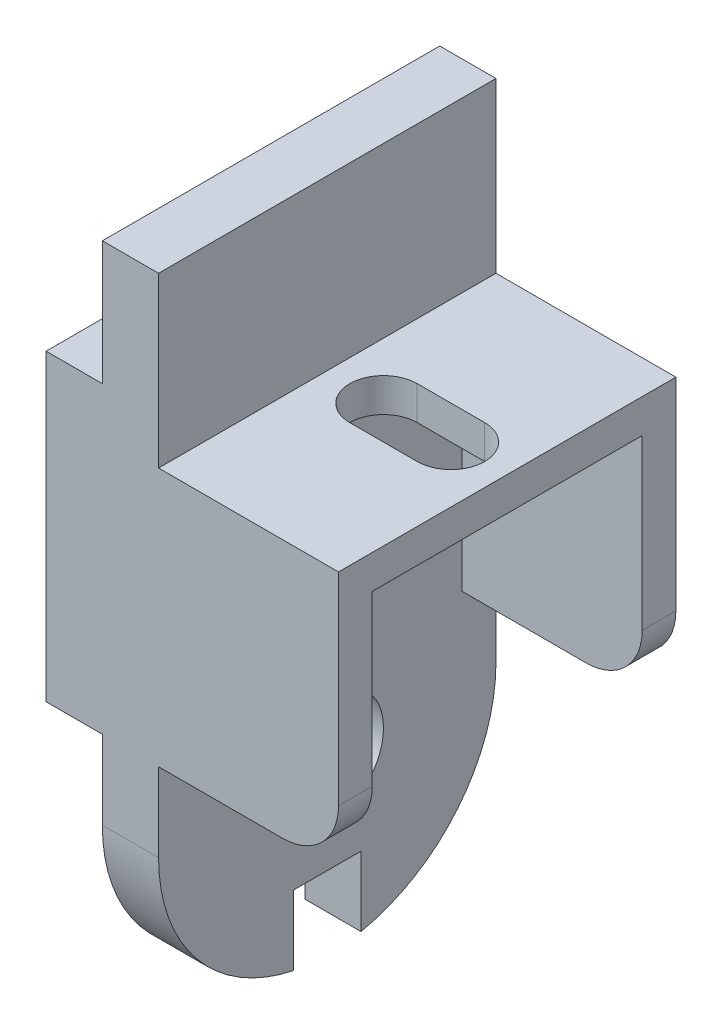
ISO-10303-21;
HEADER;
FILE_DESCRIPTION(('STEP AP214'),'2;1');
FILE_NAME('part.step','',(''),(''),'','','');
FILE_SCHEMA(('AUTOMOTIVE_DESIGN { 1 0 10303 214 1 1 1 1 }'));
ENDSEC;
DATA;
#1=APPLICATION_CONTEXT('core data for automotive mechanical design processes');
#2=APPLICATION_PROTOCOL_DEFINITION('international standard','automotive_design',2000,#1);
#3=PRODUCT_CONTEXT('',#1,'mechanical');
#4=PRODUCT('Part','Part','',(#3));
#5=PRODUCT_RELATED_PRODUCT_CATEGORY('part','',(#4));
#6=PRODUCT_DEFINITION_FORMATION('','',#4);
#7=PRODUCT_DEFINITION_CONTEXT('part definition',#1,'design');
#8=PRODUCT_DEFINITION('design','',#6,#7);
#9=PRODUCT_DEFINITION_SHAPE('','',#8);
#10=(LENGTH_UNIT() NAMED_UNIT(*) SI_UNIT(.MILLI.,.METRE.));
#11=(NAMED_UNIT(*) PLANE_ANGLE_UNIT() SI_UNIT($,.RADIAN.));
#12=(NAMED_UNIT(*) SI_UNIT($,.STERADIAN.) SOLID_ANGLE_UNIT());
#13=UNCERTAINTY_MEASURE_WITH_UNIT(LENGTH_MEASURE(1.E-05),#10,'distance_accuracy_value','');
#14=(GEOMETRIC_REPRESENTATION_CONTEXT(3) GLOBAL_UNCERTAINTY_ASSIGNED_CONTEXT((#13)) GLOBAL_UNIT_ASSIGNED_CONTEXT((#10,
#11,#12)) REPRESENTATION_CONTEXT('',''));
#15=CARTESIAN_POINT('',(0.,0.,0.));
#16=DIRECTION('',(0.,0.,1.));
#17=DIRECTION('',(1.,0.,0.));
#18=AXIS2_PLACEMENT_3D('',#15,#16,#17);
#19=CARTESIAN_POINT('',(0.,0.,0.));
#20=DIRECTION('',(1.,0.,0.));
#21=DIRECTION('',(0.,0.,-1.));
#22=AXIS2_PLACEMENT_3D('',#19,#20,#21);
#23=PLANE('',#22);
#24=DIRECTION('',(0.,0.,-1.));
#25=VECTOR('',#24,1.);
#26=CARTESIAN_POINT('',(0.,34.,-15.));
#27=LINE('',#26,#25);
#28=CARTESIAN_POINT('',(0.,34.,15.));
#29=VERTEX_POINT('',#28);
#30=CARTESIAN_POINT('',(0.,34.,-15.));
#31=VERTEX_POINT('',#30);
#32=EDGE_CURVE('E263',#29,#31,#27,.T.);
#33=ORIENTED_EDGE('',*,*,#32,.F.);
#34=DIRECTION('',(0.,1.,0.));
#35=VECTOR('',#34,1.);
#36=CARTESIAN_POINT('',(0.,0.,15.));
#37=LINE('',#36,#35);
#38=CARTESIAN_POINT('',(0.,45.,15.));
#39=VERTEX_POINT('',#38);
#40=EDGE_CURVE('E278',#29,#39,#37,.T.);
#41=ORIENTED_EDGE('',*,*,#40,.T.);
#42=DIRECTION('',(0.,0.,-1.));
#43=VECTOR('',#42,1.);
#44=CARTESIAN_POINT('',(0.,45.,0.));
#45=LINE('',#44,#43);
#46=CARTESIAN_POINT('',(0.,45.,-15.));
#47=VERTEX_POINT('',#46);
#48=EDGE_CURVE('E316',#39,#47,#45,.T.);
#49=ORIENTED_EDGE('',*,*,#48,.T.);
#50=DIRECTION('',(0.,-1.,0.));
#51=VECTOR('',#50,1.);
#52=CARTESIAN_POINT('',(0.,0.,-15.));
#53=LINE('',#52,#51);
#54=EDGE_CURVE('E318',#47,#31,#53,.T.);
#55=ORIENTED_EDGE('',*,*,#54,.T.);
#56=EDGE_LOOP('',(#33,#41,#49,#55));
#57=FACE_BOUND('',#56,.T.);
#58=ADVANCED_FACE('F49',(#57),#23,.F.);
#59=CARTESIAN_POINT('',(0.,0.,0.));
#60=DIRECTION('',(1.,0.,0.));
#61=DIRECTION('',(0.,0.,-1.));
#62=AXIS2_PLACEMENT_3D('',#59,#60,#61);
#63=CIRCLE('',#62,5.);
#64=CARTESIAN_POINT('',(0.,0.,-5.));
#65=VERTEX_POINT('',#64);
#66=EDGE_CURVE('E367',#65,#65,#63,.T.);
#67=ORIENTED_EDGE('',*,*,#66,.T.);
#68=EDGE_LOOP('',(#67));
#69=FACE_BOUND('',#68,.T.);
#70=DIRECTION('',(0.,0.,1.));
#71=VECTOR('',#70,1.);
#72=CARTESIAN_POINT('',(0.,7.,-15.));
#73=LINE('',#72,#71);
#74=CARTESIAN_POINT('',(0.,7.,-15.));
#75=VERTEX_POINT('',#74);
#76=CARTESIAN_POINT('',(0.,7.,15.));
#77=VERTEX_POINT('',#76);
#78=EDGE_CURVE('E258',#75,#77,#73,.T.);
#79=ORIENTED_EDGE('',*,*,#78,.F.);
#80=CARTESIAN_POINT('',(0.,0.,-15.));
#81=VERTEX_POINT('',#80);
#82=EDGE_CURVE('E320',#75,#81,#53,.T.);
#83=ORIENTED_EDGE('',*,*,#82,.T.);
#84=CARTESIAN_POINT('',(0.,0.,0.));
#85=DIRECTION('',(1.,0.,0.));
#86=DIRECTION('',(0.,0.,-1.));
#87=AXIS2_PLACEMENT_3D('',#84,#85,#86);
#88=CIRCLE('',#87,15.);
#89=CARTESIAN_POINT('',(0.,-14.6969384566991,-3.));
#90=VERTEX_POINT('',#89);
#91=EDGE_CURVE('E331',#90,#81,#88,.T.);
#92=ORIENTED_EDGE('',*,*,#91,.F.);
#93=DIRECTION('',(0.,1.,0.));
#94=VECTOR('',#93,1.);
#95=CARTESIAN_POINT('',(0.,0.,-3.));
#96=LINE('',#95,#94);
#97=CARTESIAN_POINT('',(0.,-8.5,-3.));
#98=VERTEX_POINT('',#97);
#99=EDGE_CURVE('E371',#90,#98,#96,.T.);
#100=ORIENTED_EDGE('',*,*,#99,.T.);
#101=DIRECTION('',(0.,0.,-1.));
#102=VECTOR('',#101,1.);
#103=CARTESIAN_POINT('',(0.,-8.5,0.));
#104=LINE('',#103,#102);
#105=CARTESIAN_POINT('',(0.,-8.5,3.));
#106=VERTEX_POINT('',#105);
#107=EDGE_CURVE('E373',#106,#98,#104,.T.);
#108=ORIENTED_EDGE('',*,*,#107,.F.);
#109=DIRECTION('',(0.,1.,0.));
#110=VECTOR('',#109,1.);
#111=CARTESIAN_POINT('',(0.,0.,3.));
#112=LINE('',#111,#110);
#113=CARTESIAN_POINT('',(0.,-14.6969384566991,3.));
#114=VERTEX_POINT('',#113);
#115=EDGE_CURVE('E327',#114,#106,#112,.T.);
#116=ORIENTED_EDGE('',*,*,#115,.F.);
#117=CARTESIAN_POINT('',(0.,0.,15.));
#118=VERTEX_POINT('',#117);
#119=EDGE_CURVE('E317',#118,#114,#88,.T.);
#120=ORIENTED_EDGE('',*,*,#119,.F.);
#121=EDGE_CURVE('E315',#118,#77,#37,.T.);
#122=ORIENTED_EDGE('',*,*,#121,.T.);
#123=EDGE_LOOP('',(#79,#83,#92,#100,#108,#116,#120,#122));
#124=FACE_BOUND('',#123,.T.);
#125=ADVANCED_FACE('F430',(#69,#124),#23,.F.);
#126=CARTESIAN_POINT('',(5.,0.,0.));
#127=DIRECTION('',(1.,0.,0.));
#128=DIRECTION('',(0.,0.,-1.));
#129=AXIS2_PLACEMENT_3D('',#126,#127,#128);
#130=PLANE('',#129);
#131=CARTESIAN_POINT('',(5.,0.,0.));
#132=DIRECTION('',(1.,0.,0.));
#133=DIRECTION('',(0.,0.,-1.));
#134=AXIS2_PLACEMENT_3D('',#131,#132,#133);
#135=CIRCLE('',#134,5.);
#136=CARTESIAN_POINT('',(5.,0.,-5.));
#137=VERTEX_POINT('',#136);
#138=EDGE_CURVE('E366',#137,#137,#135,.T.);
#139=ORIENTED_EDGE('',*,*,#138,.F.);
#140=EDGE_LOOP('',(#139));
#141=FACE_BOUND('',#140,.T.);
#142=DIRECTION('',(0.,-1.,0.));
#143=VECTOR('',#142,1.);
#144=CARTESIAN_POINT('',(5.,0.,-15.));
#145=LINE('',#144,#143);
#146=CARTESIAN_POINT('',(5.,7.,-15.));
#147=VERTEX_POINT('',#146);
#148=CARTESIAN_POINT('',(5.,0.,-15.));
#149=VERTEX_POINT('',#148);
#150=EDGE_CURVE('E403',#147,#149,#145,.T.);
#151=ORIENTED_EDGE('',*,*,#150,.F.);
#152=DIRECTION('',(0.,0.,1.));
#153=VECTOR('',#152,1.);
#154=CARTESIAN_POINT('',(5.,7.,0.));
#155=LINE('',#154,#153);
#156=CARTESIAN_POINT('',(5.,7.,-12.));
#157=VERTEX_POINT('',#156);
#158=EDGE_CURVE('E391',#147,#157,#155,.T.);
#159=ORIENTED_EDGE('',*,*,#158,.T.);
#160=DIRECTION('',(0.,1.,0.));
#161=VECTOR('',#160,1.);
#162=CARTESIAN_POINT('',(5.,0.,-12.));
#163=LINE('',#162,#161);
#164=CARTESIAN_POINT('',(5.,27.,-12.));
#165=VERTEX_POINT('',#164);
#166=EDGE_CURVE('E386',#157,#165,#163,.T.);
#167=ORIENTED_EDGE('',*,*,#166,.T.);
#168=DIRECTION('',(0.,0.,1.));
#169=VECTOR('',#168,1.);
#170=CARTESIAN_POINT('',(5.,27.,0.));
#171=LINE('',#170,#169);
#172=CARTESIAN_POINT('',(5.,27.,12.));
#173=VERTEX_POINT('',#172);
#174=EDGE_CURVE('E452',#165,#173,#171,.T.);
#175=ORIENTED_EDGE('',*,*,#174,.T.);
#176=DIRECTION('',(0.,-1.,0.));
#177=VECTOR('',#176,1.);
#178=CARTESIAN_POINT('',(5.,0.,12.));
#179=LINE('',#178,#177);
#180=CARTESIAN_POINT('',(5.,7.,12.));
#181=VERTEX_POINT('',#180);
#182=EDGE_CURVE('E478',#173,#181,#179,.T.);
#183=ORIENTED_EDGE('',*,*,#182,.T.);
#184=DIRECTION('',(0.,0.,1.));
#185=VECTOR('',#184,1.);
#186=CARTESIAN_POINT('',(5.,7.,0.));
#187=LINE('',#186,#185);
#188=CARTESIAN_POINT('',(5.,7.,15.));
#189=VERTEX_POINT('',#188);
#190=EDGE_CURVE('E481',#181,#189,#187,.T.);
#191=ORIENTED_EDGE('',*,*,#190,.T.);
#192=DIRECTION('',(0.,1.,0.));
#193=VECTOR('',#192,1.);
#194=CARTESIAN_POINT('',(5.,0.,15.));
#195=LINE('',#194,#193);
#196=CARTESIAN_POINT('',(5.,0.,15.));
#197=VERTEX_POINT('',#196);
#198=EDGE_CURVE('E412',#197,#189,#195,.T.);
#199=ORIENTED_EDGE('',*,*,#198,.F.);
#200=CARTESIAN_POINT('',(5.,0.,0.));
#201=DIRECTION('',(1.,0.,0.));
#202=DIRECTION('',(0.,0.,-1.));
#203=AXIS2_PLACEMENT_3D('',#200,#201,#202);
#204=CIRCLE('',#203,15.);
#205=CARTESIAN_POINT('',(5.,-14.6969384566991,3.));
#206=VERTEX_POINT('',#205);
#207=EDGE_CURVE('E404',#197,#206,#204,.T.);
#208=ORIENTED_EDGE('',*,*,#207,.T.);
#209=DIRECTION('',(0.,1.,0.));
#210=VECTOR('',#209,1.);
#211=CARTESIAN_POINT('',(5.,0.,3.));
#212=LINE('',#211,#210);
#213=CARTESIAN_POINT('',(5.,-8.5,3.));
#214=VERTEX_POINT('',#213);
#215=EDGE_CURVE('E415',#206,#214,#212,.T.);
#216=ORIENTED_EDGE('',*,*,#215,.T.);
#217=DIRECTION('',(0.,0.,-1.));
#218=VECTOR('',#217,1.);
#219=CARTESIAN_POINT('',(5.,-8.5,0.));
#220=LINE('',#219,#218);
#221=CARTESIAN_POINT('',(5.,-8.5,-3.));
#222=VERTEX_POINT('',#221);
#223=EDGE_CURVE('E417',#214,#222,#220,.T.);
#224=ORIENTED_EDGE('',*,*,#223,.T.);
#225=DIRECTION('',(0.,1.,0.));
#226=VECTOR('',#225,1.);
#227=CARTESIAN_POINT('',(5.,0.,-3.));
#228=LINE('',#227,#226);
#229=CARTESIAN_POINT('',(5.,-14.6969384566991,-3.));
#230=VERTEX_POINT('',#229);
#231=EDGE_CURVE('E419',#230,#222,#228,.T.);
#232=ORIENTED_EDGE('',*,*,#231,.F.);
#233=EDGE_CURVE('E370',#230,#149,#204,.T.);
#234=ORIENTED_EDGE('',*,*,#233,.T.);
#235=EDGE_LOOP('',(#151,#159,#167,#175,#183,#191,#199,#208,#216,#224,#232,#234));
#236=FACE_BOUND('',#235,.T.);
#237=ADVANCED_FACE('F427',(#141,#236),#130,.T.);
#238=CARTESIAN_POINT('',(5.,0.,0.));
#239=DIRECTION('',(-1.,0.,0.));
#240=DIRECTION('',(0.,0.,1.));
#241=AXIS2_PLACEMENT_3D('',#238,#239,#240);
#242=CYLINDRICAL_SURFACE('',#241,15.);
#243=ORIENTED_EDGE('',*,*,#91,.T.);
#244=DIRECTION('',(-1.,0.,0.));
#245=VECTOR('',#244,1.);
#246=CARTESIAN_POINT('',(5.,0.,-15.));
#247=LINE('',#246,#245);
#248=EDGE_CURVE('E348',#149,#81,#247,.T.);
#249=ORIENTED_EDGE('',*,*,#248,.F.);
#250=ORIENTED_EDGE('',*,*,#233,.F.);
#251=DIRECTION('',(-1.,0.,0.));
#252=VECTOR('',#251,1.);
#253=CARTESIAN_POINT('',(5.,-14.6969384566991,-3.));
#254=LINE('',#253,#252);
#255=EDGE_CURVE('E364',#230,#90,#254,.T.);
#256=ORIENTED_EDGE('',*,*,#255,.T.);
#257=EDGE_LOOP('',(#243,#249,#250,#256));
#258=FACE_BOUND('',#257,.T.);
#259=ADVANCED_FACE('F429',(#258),#242,.T.);
#260=CARTESIAN_POINT('',(5.,0.,-15.));
#261=DIRECTION('',(0.,0.,-1.));
#262=DIRECTION('',(-1.,0.,0.));
#263=AXIS2_PLACEMENT_3D('',#260,#261,#262);
#264=PLANE('',#263);
#265=DIRECTION('',(0.,1.,0.));
#266=VECTOR('',#265,1.);
#267=CARTESIAN_POINT('',(21.,0.,-15.));
#268=LINE('',#267,#266);
#269=CARTESIAN_POINT('',(21.,12.,-15.));
#270=VERTEX_POINT('',#269);
#271=CARTESIAN_POINT('',(21.,30.,-15.));
#272=VERTEX_POINT('',#271);
#273=EDGE_CURVE('E546',#270,#272,#268,.T.);
#274=ORIENTED_EDGE('',*,*,#273,.F.);
#275=CARTESIAN_POINT('',(16.,12.,-15.));
#276=DIRECTION('',(0.,0.,-1.));
#277=DIRECTION('',(-1.,0.,0.));
#278=AXIS2_PLACEMENT_3D('',#275,#276,#277);
#279=CIRCLE('',#278,5.);
#280=CARTESIAN_POINT('',(16.,7.,-15.));
#281=VERTEX_POINT('',#280);
#282=EDGE_CURVE('E334',#270,#281,#279,.T.);
#283=ORIENTED_EDGE('',*,*,#282,.T.);
#284=DIRECTION('',(-1.,0.,0.));
#285=VECTOR('',#284,1.);
#286=CARTESIAN_POINT('',(21.,7.,-15.));
#287=LINE('',#286,#285);
#288=EDGE_CURVE('E442',#281,#147,#287,.T.);
#289=ORIENTED_EDGE('',*,*,#288,.T.);
#290=ORIENTED_EDGE('',*,*,#150,.T.);
#291=ORIENTED_EDGE('',*,*,#248,.T.);
#292=ORIENTED_EDGE('',*,*,#82,.F.);
#293=DIRECTION('',(1.,0.,0.));
#294=VECTOR('',#293,1.);
#295=CARTESIAN_POINT('',(-5.,7.,-15.));
#296=LINE('',#295,#294);
#297=CARTESIAN_POINT('',(-5.,7.,-15.));
#298=VERTEX_POINT('',#297);
#299=EDGE_CURVE('E284',#298,#75,#296,.T.);
#300=ORIENTED_EDGE('',*,*,#299,.F.);
#301=DIRECTION('',(0.,-1.,0.));
#302=VECTOR('',#301,1.);
#303=CARTESIAN_POINT('',(-5.,7.,-15.));
#304=LINE('',#303,#302);
#305=CARTESIAN_POINT('',(-5.,34.,-15.));
#306=VERTEX_POINT('',#305);
#307=EDGE_CURVE('E259',#306,#298,#304,.T.);
#308=ORIENTED_EDGE('',*,*,#307,.F.);
#309=DIRECTION('',(1.,0.,0.));
#310=VECTOR('',#309,1.);
#311=CARTESIAN_POINT('',(-5.,34.,-15.));
#312=LINE('',#311,#310);
#313=EDGE_CURVE('E269',#306,#31,#312,.T.);
#314=ORIENTED_EDGE('',*,*,#313,.T.);
#315=ORIENTED_EDGE('',*,*,#54,.F.);
#316=DIRECTION('',(-1.,0.,0.));
#317=VECTOR('',#316,1.);
#318=CARTESIAN_POINT('',(5.,45.,-15.));
#319=LINE('',#318,#317);
#320=CARTESIAN_POINT('',(5.,45.,-15.));
#321=VERTEX_POINT('',#320);
#322=EDGE_CURVE('E351',#321,#47,#319,.T.);
#323=ORIENTED_EDGE('',*,*,#322,.F.);
#324=CARTESIAN_POINT('',(5.,30.,-15.));
#325=VERTEX_POINT('',#324);
#326=EDGE_CURVE('E405',#321,#325,#145,.T.);
#327=ORIENTED_EDGE('',*,*,#326,.T.);
#328=DIRECTION('',(-1.,0.,0.));
#329=VECTOR('',#328,1.);
#330=CARTESIAN_POINT('',(21.,30.,-15.));
#331=LINE('',#330,#329);
#332=EDGE_CURVE('E446',#272,#325,#331,.T.);
#333=ORIENTED_EDGE('',*,*,#332,.F.);
#334=EDGE_LOOP('',(#274,#283,#289,#290,#291,#292,#300,#308,#314,#315,#323,#327,#333));
#335=FACE_BOUND('',#334,.T.);
#336=ADVANCED_FACE('F439',(#335),#264,.T.);
#337=CARTESIAN_POINT('',(5.,45.,0.));
#338=DIRECTION('',(0.,1.,0.));
#339=DIRECTION('',(0.,0.,1.));
#340=AXIS2_PLACEMENT_3D('',#337,#338,#339);
#341=PLANE('',#340);
#342=ORIENTED_EDGE('',*,*,#48,.F.);
#343=DIRECTION('',(-1.,0.,0.));
#344=VECTOR('',#343,1.);
#345=CARTESIAN_POINT('',(5.,45.,15.));
#346=LINE('',#345,#344);
#347=CARTESIAN_POINT('',(5.,45.,15.));
#348=VERTEX_POINT('',#347);
#349=EDGE_CURVE('E311',#348,#39,#346,.T.);
#350=ORIENTED_EDGE('',*,*,#349,.F.);
#351=DIRECTION('',(0.,0.,-1.));
#352=VECTOR('',#351,1.);
#353=CARTESIAN_POINT('',(5.,45.,0.));
#354=LINE('',#353,#352);
#355=EDGE_CURVE('E408',#348,#321,#354,.T.);
#356=ORIENTED_EDGE('',*,*,#355,.T.);
#357=ORIENTED_EDGE('',*,*,#322,.T.);
#358=EDGE_LOOP('',(#342,#350,#356,#357));
#359=FACE_BOUND('',#358,.T.);
#360=ADVANCED_FACE('F497',(#359),#341,.T.);
#361=CARTESIAN_POINT('',(5.,0.,15.));
#362=DIRECTION('',(0.,0.,1.));
#363=DIRECTION('',(1.,0.,0.));
#364=AXIS2_PLACEMENT_3D('',#361,#362,#363);
#365=PLANE('',#364);
#366=DIRECTION('',(-1.,0.,0.));
#367=VECTOR('',#366,1.);
#368=CARTESIAN_POINT('',(21.,7.,15.));
#369=LINE('',#368,#367);
#370=CARTESIAN_POINT('',(16.,7.,15.));
#371=VERTEX_POINT('',#370);
#372=EDGE_CURVE('E471',#371,#189,#369,.T.);
#373=ORIENTED_EDGE('',*,*,#372,.F.);
#374=CARTESIAN_POINT('',(16.,12.,15.));
#375=DIRECTION('',(0.,0.,1.));
#376=DIRECTION('',(1.,0.,0.));
#377=AXIS2_PLACEMENT_3D('',#374,#375,#376);
#378=CIRCLE('',#377,5.);
#379=CARTESIAN_POINT('',(21.,12.,15.));
#380=VERTEX_POINT('',#379);
#381=EDGE_CURVE('E336',#371,#380,#378,.T.);
#382=ORIENTED_EDGE('',*,*,#381,.T.);
#383=DIRECTION('',(0.,1.,0.));
#384=VECTOR('',#383,1.);
#385=CARTESIAN_POINT('',(21.,0.,15.));
#386=LINE('',#385,#384);
#387=CARTESIAN_POINT('',(21.,30.,15.));
#388=VERTEX_POINT('',#387);
#389=EDGE_CURVE('E494',#380,#388,#386,.T.);
#390=ORIENTED_EDGE('',*,*,#389,.T.);
#391=DIRECTION('',(-1.,0.,0.));
#392=VECTOR('',#391,1.);
#393=CARTESIAN_POINT('',(21.,30.,15.));
#394=LINE('',#393,#392);
#395=CARTESIAN_POINT('',(5.,30.,15.));
#396=VERTEX_POINT('',#395);
#397=EDGE_CURVE('E473',#388,#396,#394,.T.);
#398=ORIENTED_EDGE('',*,*,#397,.T.);
#399=EDGE_CURVE('E411',#396,#348,#195,.T.);
#400=ORIENTED_EDGE('',*,*,#399,.T.);
#401=ORIENTED_EDGE('',*,*,#349,.T.);
#402=ORIENTED_EDGE('',*,*,#40,.F.);
#403=DIRECTION('',(1.,0.,0.));
#404=VECTOR('',#403,1.);
#405=CARTESIAN_POINT('',(-5.,34.,15.));
#406=LINE('',#405,#404);
#407=CARTESIAN_POINT('',(-5.,34.,15.));
#408=VERTEX_POINT('',#407);
#409=EDGE_CURVE('E285',#408,#29,#406,.T.);
#410=ORIENTED_EDGE('',*,*,#409,.F.);
#411=DIRECTION('',(0.,1.,0.));
#412=VECTOR('',#411,1.);
#413=CARTESIAN_POINT('',(-5.,7.,15.));
#414=LINE('',#413,#412);
#415=CARTESIAN_POINT('',(-5.,7.,15.));
#416=VERTEX_POINT('',#415);
#417=EDGE_CURVE('E265',#416,#408,#414,.T.);
#418=ORIENTED_EDGE('',*,*,#417,.F.);
#419=DIRECTION('',(1.,0.,0.));
#420=VECTOR('',#419,1.);
#421=CARTESIAN_POINT('',(-5.,7.,15.));
#422=LINE('',#421,#420);
#423=EDGE_CURVE('E281',#416,#77,#422,.T.);
#424=ORIENTED_EDGE('',*,*,#423,.T.);
#425=ORIENTED_EDGE('',*,*,#121,.F.);
#426=DIRECTION('',(-1.,0.,0.));
#427=VECTOR('',#426,1.);
#428=CARTESIAN_POINT('',(5.,0.,15.));
#429=LINE('',#428,#427);
#430=EDGE_CURVE('E354',#197,#118,#429,.T.);
#431=ORIENTED_EDGE('',*,*,#430,.F.);
#432=ORIENTED_EDGE('',*,*,#198,.T.);
#433=EDGE_LOOP('',(#373,#382,#390,#398,#400,#401,#402,#410,#418,#424,#425,#431,#432));
#434=FACE_BOUND('',#433,.T.);
#435=ADVANCED_FACE('F308',(#434),#365,.T.);
#436=ORIENTED_EDGE('',*,*,#119,.T.);
#437=DIRECTION('',(-1.,0.,0.));
#438=VECTOR('',#437,1.);
#439=CARTESIAN_POINT('',(5.,-14.6969384566991,3.));
#440=LINE('',#439,#438);
#441=EDGE_CURVE('E356',#206,#114,#440,.T.);
#442=ORIENTED_EDGE('',*,*,#441,.F.);
#443=ORIENTED_EDGE('',*,*,#207,.F.);
#444=ORIENTED_EDGE('',*,*,#430,.T.);
#445=EDGE_LOOP('',(#436,#442,#443,#444));
#446=FACE_BOUND('',#445,.T.);
#447=ADVANCED_FACE('F520',(#446),#242,.T.);
#448=CARTESIAN_POINT('',(5.,0.,3.));
#449=DIRECTION('',(0.,0.,1.));
#450=DIRECTION('',(1.,0.,0.));
#451=AXIS2_PLACEMENT_3D('',#448,#449,#450);
#452=PLANE('',#451);
#453=ORIENTED_EDGE('',*,*,#115,.T.);
#454=DIRECTION('',(-1.,0.,0.));
#455=VECTOR('',#454,1.);
#456=CARTESIAN_POINT('',(5.,-8.5,3.));
#457=LINE('',#456,#455);
#458=EDGE_CURVE('E359',#214,#106,#457,.T.);
#459=ORIENTED_EDGE('',*,*,#458,.F.);
#460=ORIENTED_EDGE('',*,*,#215,.F.);
#461=ORIENTED_EDGE('',*,*,#441,.T.);
#462=EDGE_LOOP('',(#453,#459,#460,#461));
#463=FACE_BOUND('',#462,.T.);
#464=ADVANCED_FACE('F517',(#463),#452,.F.);
#465=CARTESIAN_POINT('',(5.,-8.5,0.));
#466=DIRECTION('',(0.,1.,0.));
#467=DIRECTION('',(0.,0.,1.));
#468=AXIS2_PLACEMENT_3D('',#465,#466,#467);
#469=PLANE('',#468);
#470=ORIENTED_EDGE('',*,*,#107,.T.);
#471=DIRECTION('',(-1.,0.,0.));
#472=VECTOR('',#471,1.);
#473=CARTESIAN_POINT('',(5.,-8.5,-3.));
#474=LINE('',#473,#472);
#475=EDGE_CURVE('E362',#222,#98,#474,.T.);
#476=ORIENTED_EDGE('',*,*,#475,.F.);
#477=ORIENTED_EDGE('',*,*,#223,.F.);
#478=ORIENTED_EDGE('',*,*,#458,.T.);
#479=EDGE_LOOP('',(#470,#476,#477,#478));
#480=FACE_BOUND('',#479,.T.);
#481=ADVANCED_FACE('F513',(#480),#469,.F.);
#482=CARTESIAN_POINT('',(5.,0.,-3.));
#483=DIRECTION('',(0.,0.,1.));
#484=DIRECTION('',(1.,0.,0.));
#485=AXIS2_PLACEMENT_3D('',#482,#483,#484);
#486=PLANE('',#485);
#487=ORIENTED_EDGE('',*,*,#99,.F.);
#488=ORIENTED_EDGE('',*,*,#255,.F.);
#489=ORIENTED_EDGE('',*,*,#231,.T.);
#490=ORIENTED_EDGE('',*,*,#475,.T.);
#491=EDGE_LOOP('',(#487,#488,#489,#490));
#492=FACE_BOUND('',#491,.T.);
#493=ADVANCED_FACE('F510',(#492),#486,.T.);
#494=CARTESIAN_POINT('',(5.,0.,0.));
#495=DIRECTION('',(-1.,0.,0.));
#496=DIRECTION('',(0.,0.,1.));
#497=AXIS2_PLACEMENT_3D('',#494,#495,#496);
#498=CYLINDRICAL_SURFACE('',#497,5.);
#499=ORIENTED_EDGE('',*,*,#138,.T.);
#500=EDGE_LOOP('',(#499));
#501=FACE_BOUND('',#500,.T.);
#502=ORIENTED_EDGE('',*,*,#66,.F.);
#503=EDGE_LOOP('',(#502));
#504=FACE_BOUND('',#503,.T.);
#505=ADVANCED_FACE('F424',(#501,#504),#498,.F.);
#506=DIRECTION('',(0.,0.,1.));
#507=VECTOR('',#506,1.);
#508=CARTESIAN_POINT('',(5.,30.,0.));
#509=LINE('',#508,#507);
#510=EDGE_CURVE('E397',#325,#396,#509,.T.);
#511=ORIENTED_EDGE('',*,*,#510,.F.);
#512=ORIENTED_EDGE('',*,*,#326,.F.);
#513=ORIENTED_EDGE('',*,*,#355,.F.);
#514=ORIENTED_EDGE('',*,*,#399,.F.);
#515=EDGE_LOOP('',(#511,#512,#513,#514));
#516=FACE_BOUND('',#515,.T.);
#517=ADVANCED_FACE('F432',(#516),#130,.T.);
#518=CARTESIAN_POINT('',(21.,0.,-12.));
#519=DIRECTION('',(0.,0.,-1.));
#520=DIRECTION('',(-1.,0.,0.));
#521=AXIS2_PLACEMENT_3D('',#518,#519,#520);
#522=PLANE('',#521);
#523=DIRECTION('',(-1.,0.,0.));
#524=VECTOR('',#523,1.);
#525=CARTESIAN_POINT('',(21.,7.,-12.));
#526=LINE('',#525,#524);
#527=CARTESIAN_POINT('',(16.,7.,-12.));
#528=VERTEX_POINT('',#527);
#529=EDGE_CURVE('E445',#528,#157,#526,.T.);
#530=ORIENTED_EDGE('',*,*,#529,.F.);
#531=CARTESIAN_POINT('',(16.,12.,-12.));
#532=DIRECTION('',(0.,0.,-1.));
#533=DIRECTION('',(-1.,0.,0.));
#534=AXIS2_PLACEMENT_3D('',#531,#532,#533);
#535=CIRCLE('',#534,5.);
#536=CARTESIAN_POINT('',(21.,12.,-12.));
#537=VERTEX_POINT('',#536);
#538=EDGE_CURVE('E13',#528,#537,#535,.F.);
#539=ORIENTED_EDGE('',*,*,#538,.T.);
#540=DIRECTION('',(0.,-1.,0.));
#541=VECTOR('',#540,1.);
#542=CARTESIAN_POINT('',(21.,0.,-12.));
#543=LINE('',#542,#541);
#544=CARTESIAN_POINT('',(21.,27.,-12.));
#545=VERTEX_POINT('',#544);
#546=EDGE_CURVE('E290',#545,#537,#543,.T.);
#547=ORIENTED_EDGE('',*,*,#546,.F.);
#548=DIRECTION('',(-1.,0.,0.));
#549=VECTOR('',#548,1.);
#550=CARTESIAN_POINT('',(21.,27.,-12.));
#551=LINE('',#550,#549);
#552=EDGE_CURVE('E458',#545,#165,#551,.T.);
#553=ORIENTED_EDGE('',*,*,#552,.T.);
#554=ORIENTED_EDGE('',*,*,#166,.F.);
#555=EDGE_LOOP('',(#530,#539,#547,#553,#554));
#556=FACE_BOUND('',#555,.T.);
#557=ADVANCED_FACE('F455',(#556),#522,.F.);
#558=CARTESIAN_POINT('',(21.,7.,0.));
#559=DIRECTION('',(0.,1.,0.));
#560=DIRECTION('',(0.,0.,1.));
#561=AXIS2_PLACEMENT_3D('',#558,#559,#560);
#562=PLANE('',#561);
#563=ORIENTED_EDGE('',*,*,#288,.F.);
#564=DIRECTION('',(0.,0.,-1.));
#565=VECTOR('',#564,1.);
#566=CARTESIAN_POINT('',(16.,7.,-12.));
#567=LINE('',#566,#565);
#568=EDGE_CURVE('E58',#281,#528,#567,.F.);
#569=ORIENTED_EDGE('',*,*,#568,.T.);
#570=ORIENTED_EDGE('',*,*,#529,.T.);
#571=ORIENTED_EDGE('',*,*,#158,.F.);
#572=EDGE_LOOP('',(#563,#569,#570,#571));
#573=FACE_BOUND('',#572,.T.);
#574=ADVANCED_FACE('F448',(#573),#562,.F.);
#575=CARTESIAN_POINT('',(21.,30.,0.));
#576=DIRECTION('',(0.,1.,0.));
#577=DIRECTION('',(0.,0.,1.));
#578=AXIS2_PLACEMENT_3D('',#575,#576,#577);
#579=PLANE('',#578);
#580=CARTESIAN_POINT('',(10.,30.,0.));
#581=DIRECTION('',(0.,1.,0.));
#582=DIRECTION('',(0.,0.,1.));
#583=AXIS2_PLACEMENT_3D('',#580,#581,#582);
#584=CIRCLE('',#583,3.);
#585=CARTESIAN_POINT('',(10.,30.,-3.));
#586=VERTEX_POINT('',#585);
#587=CARTESIAN_POINT('',(10.,30.,3.));
#588=VERTEX_POINT('',#587);
#589=EDGE_CURVE('E256',#586,#588,#584,.T.);
#590=ORIENTED_EDGE('',*,*,#589,.F.);
#591=DIRECTION('',(-1.,0.,0.));
#592=VECTOR('',#591,1.);
#593=CARTESIAN_POINT('',(21.,30.,-3.));
#594=LINE('',#593,#592);
#595=CARTESIAN_POINT('',(16.,30.,-3.));
#596=VERTEX_POINT('',#595);
#597=EDGE_CURVE('E249',#596,#586,#594,.T.);
#598=ORIENTED_EDGE('',*,*,#597,.F.);
#599=CARTESIAN_POINT('',(16.,30.,0.));
#600=DIRECTION('',(0.,1.,0.));
#601=DIRECTION('',(0.,0.,1.));
#602=AXIS2_PLACEMENT_3D('',#599,#600,#601);
#603=CIRCLE('',#602,3.);
#604=CARTESIAN_POINT('',(16.,30.,3.));
#605=VERTEX_POINT('',#604);
#606=EDGE_CURVE('E229',#605,#596,#603,.T.);
#607=ORIENTED_EDGE('',*,*,#606,.F.);
#608=DIRECTION('',(1.,0.,0.));
#609=VECTOR('',#608,1.);
#610=CARTESIAN_POINT('',(21.,30.,3.));
#611=LINE('',#610,#609);
#612=EDGE_CURVE('E254',#588,#605,#611,.T.);
#613=ORIENTED_EDGE('',*,*,#612,.F.);
#614=EDGE_LOOP('',(#590,#598,#607,#613));
#615=FACE_BOUND('',#614,.T.);
#616=ORIENTED_EDGE('',*,*,#332,.T.);
#617=ORIENTED_EDGE('',*,*,#510,.T.);
#618=ORIENTED_EDGE('',*,*,#397,.F.);
#619=DIRECTION('',(0.,0.,-1.));
#620=VECTOR('',#619,1.);
#621=CARTESIAN_POINT('',(21.,30.,0.));
#622=LINE('',#621,#620);
#623=EDGE_CURVE('E544',#388,#272,#622,.T.);
#624=ORIENTED_EDGE('',*,*,#623,.T.);
#625=EDGE_LOOP('',(#616,#617,#618,#624));
#626=FACE_BOUND('',#625,.T.);
#627=ADVANCED_FACE('F486',(#615,#626),#579,.T.);
#628=CARTESIAN_POINT('',(21.,7.,0.));
#629=DIRECTION('',(0.,1.,0.));
#630=DIRECTION('',(0.,0.,1.));
#631=AXIS2_PLACEMENT_3D('',#628,#629,#630);
#632=PLANE('',#631);
#633=DIRECTION('',(-1.,0.,0.));
#634=VECTOR('',#633,1.);
#635=CARTESIAN_POINT('',(21.,7.,12.));
#636=LINE('',#635,#634);
#637=CARTESIAN_POINT('',(16.,7.,12.));
#638=VERTEX_POINT('',#637);
#639=EDGE_CURVE('E464',#638,#181,#636,.T.);
#640=ORIENTED_EDGE('',*,*,#639,.F.);
#641=DIRECTION('',(0.,0.,-1.));
#642=VECTOR('',#641,1.);
#643=CARTESIAN_POINT('',(16.,7.,15.));
#644=LINE('',#643,#642);
#645=EDGE_CURVE('E338',#638,#371,#644,.F.);
#646=ORIENTED_EDGE('',*,*,#645,.T.);
#647=ORIENTED_EDGE('',*,*,#372,.T.);
#648=ORIENTED_EDGE('',*,*,#190,.F.);
#649=EDGE_LOOP('',(#640,#646,#647,#648));
#650=FACE_BOUND('',#649,.T.);
#651=ADVANCED_FACE('F625',(#650),#632,.F.);
#652=CARTESIAN_POINT('',(21.,0.,12.));
#653=DIRECTION('',(0.,0.,1.));
#654=DIRECTION('',(1.,0.,0.));
#655=AXIS2_PLACEMENT_3D('',#652,#653,#654);
#656=PLANE('',#655);
#657=DIRECTION('',(0.,1.,0.));
#658=VECTOR('',#657,1.);
#659=CARTESIAN_POINT('',(21.,0.,12.));
#660=LINE('',#659,#658);
#661=CARTESIAN_POINT('',(21.,12.,12.));
#662=VERTEX_POINT('',#661);
#663=CARTESIAN_POINT('',(21.,27.,12.));
#664=VERTEX_POINT('',#663);
#665=EDGE_CURVE('E466',#662,#664,#660,.T.);
#666=ORIENTED_EDGE('',*,*,#665,.F.);
#667=CARTESIAN_POINT('',(16.,12.,12.));
#668=DIRECTION('',(0.,0.,1.));
#669=DIRECTION('',(1.,0.,0.));
#670=AXIS2_PLACEMENT_3D('',#667,#668,#669);
#671=CIRCLE('',#670,5.);
#672=EDGE_CURVE('E340',#662,#638,#671,.F.);
#673=ORIENTED_EDGE('',*,*,#672,.T.);
#674=ORIENTED_EDGE('',*,*,#639,.T.);
#675=ORIENTED_EDGE('',*,*,#182,.F.);
#676=DIRECTION('',(-1.,0.,0.));
#677=VECTOR('',#676,1.);
#678=CARTESIAN_POINT('',(21.,27.,12.));
#679=LINE('',#678,#677);
#680=EDGE_CURVE('E461',#664,#173,#679,.T.);
#681=ORIENTED_EDGE('',*,*,#680,.F.);
#682=EDGE_LOOP('',(#666,#673,#674,#675,#681));
#683=FACE_BOUND('',#682,.T.);
#684=ADVANCED_FACE('F553',(#683),#656,.F.);
#685=CARTESIAN_POINT('',(21.,27.,0.));
#686=DIRECTION('',(0.,1.,0.));
#687=DIRECTION('',(0.,0.,1.));
#688=AXIS2_PLACEMENT_3D('',#685,#686,#687);
#689=PLANE('',#688);
#690=DIRECTION('',(1.,0.,0.));
#691=VECTOR('',#690,1.);
#692=CARTESIAN_POINT('',(10.,27.,-3.));
#693=LINE('',#692,#691);
#694=CARTESIAN_POINT('',(10.,27.,-3.));
#695=VERTEX_POINT('',#694);
#696=CARTESIAN_POINT('',(16.,27.,-3.));
#697=VERTEX_POINT('',#696);
#698=EDGE_CURVE('E235',#695,#697,#693,.T.);
#699=ORIENTED_EDGE('',*,*,#698,.F.);
#700=CARTESIAN_POINT('',(10.,27.,0.));
#701=DIRECTION('',(0.,-1.,0.));
#702=DIRECTION('',(0.,0.,-1.));
#703=AXIS2_PLACEMENT_3D('',#700,#701,#702);
#704=CIRCLE('',#703,3.);
#705=CARTESIAN_POINT('',(10.,27.,3.));
#706=VERTEX_POINT('',#705);
#707=EDGE_CURVE('E74',#706,#695,#704,.T.);
#708=ORIENTED_EDGE('',*,*,#707,.F.);
#709=DIRECTION('',(-1.,0.,0.));
#710=VECTOR('',#709,1.);
#711=CARTESIAN_POINT('',(10.,27.,3.));
#712=LINE('',#711,#710);
#713=CARTESIAN_POINT('',(16.,27.,3.));
#714=VERTEX_POINT('',#713);
#715=EDGE_CURVE('E242',#714,#706,#712,.T.);
#716=ORIENTED_EDGE('',*,*,#715,.F.);
#717=CARTESIAN_POINT('',(16.,27.,0.));
#718=DIRECTION('',(0.,-1.,0.));
#719=DIRECTION('',(0.,0.,-1.));
#720=AXIS2_PLACEMENT_3D('',#717,#718,#719);
#721=CIRCLE('',#720,3.);
#722=EDGE_CURVE('E226',#697,#714,#721,.T.);
#723=ORIENTED_EDGE('',*,*,#722,.F.);
#724=EDGE_LOOP('',(#699,#708,#716,#723));
#725=FACE_BOUND('',#724,.T.);
#726=ORIENTED_EDGE('',*,*,#174,.F.);
#727=ORIENTED_EDGE('',*,*,#552,.F.);
#728=DIRECTION('',(0.,0.,-1.));
#729=VECTOR('',#728,1.);
#730=CARTESIAN_POINT('',(21.,27.,0.));
#731=LINE('',#730,#729);
#732=EDGE_CURVE('E462',#664,#545,#731,.T.);
#733=ORIENTED_EDGE('',*,*,#732,.F.);
#734=ORIENTED_EDGE('',*,*,#680,.T.);
#735=EDGE_LOOP('',(#726,#727,#733,#734));
#736=FACE_BOUND('',#735,.T.);
#737=ADVANCED_FACE('F239',(#725,#736),#689,.F.);
#738=CARTESIAN_POINT('',(21.,0.,0.));
#739=DIRECTION('',(1.,0.,0.));
#740=DIRECTION('',(0.,0.,-1.));
#741=AXIS2_PLACEMENT_3D('',#738,#739,#740);
#742=PLANE('',#741);
#743=ORIENTED_EDGE('',*,*,#389,.F.);
#744=DIRECTION('',(0.,0.,-1.));
#745=VECTOR('',#744,1.);
#746=CARTESIAN_POINT('',(21.,12.,12.));
#747=LINE('',#746,#745);
#748=EDGE_CURVE('E342',#380,#662,#747,.T.);
#749=ORIENTED_EDGE('',*,*,#748,.T.);
#750=ORIENTED_EDGE('',*,*,#665,.T.);
#751=ORIENTED_EDGE('',*,*,#732,.T.);
#752=ORIENTED_EDGE('',*,*,#546,.T.);
#753=DIRECTION('',(0.,0.,-1.));
#754=VECTOR('',#753,1.);
#755=CARTESIAN_POINT('',(21.,12.,-15.));
#756=LINE('',#755,#754);
#757=EDGE_CURVE('E345',#537,#270,#756,.T.);
#758=ORIENTED_EDGE('',*,*,#757,.T.);
#759=ORIENTED_EDGE('',*,*,#273,.T.);
#760=ORIENTED_EDGE('',*,*,#623,.F.);
#761=EDGE_LOOP('',(#743,#749,#750,#751,#752,#758,#759,#760));
#762=FACE_BOUND('',#761,.T.);
#763=ADVANCED_FACE('F530',(#762),#742,.T.);
#764=CARTESIAN_POINT('',(16.,12.,0.));
#765=DIRECTION('',(0.,0.,1.));
#766=DIRECTION('',(1.,0.,0.));
#767=AXIS2_PLACEMENT_3D('',#764,#765,#766);
#768=CYLINDRICAL_SURFACE('',#767,5.);
#769=ORIENTED_EDGE('',*,*,#381,.F.);
#770=ORIENTED_EDGE('',*,*,#645,.F.);
#771=ORIENTED_EDGE('',*,*,#672,.F.);
#772=ORIENTED_EDGE('',*,*,#748,.F.);
#773=EDGE_LOOP('',(#769,#770,#771,#772));
#774=FACE_BOUND('',#773,.T.);
#775=ADVANCED_FACE('F528',(#774),#768,.T.);
#776=CARTESIAN_POINT('',(16.,12.,0.));
#777=DIRECTION('',(0.,0.,1.));
#778=DIRECTION('',(1.,0.,0.));
#779=AXIS2_PLACEMENT_3D('',#776,#777,#778);
#780=CYLINDRICAL_SURFACE('',#779,5.);
#781=ORIENTED_EDGE('',*,*,#538,.F.);
#782=ORIENTED_EDGE('',*,*,#568,.F.);
#783=ORIENTED_EDGE('',*,*,#282,.F.);
#784=ORIENTED_EDGE('',*,*,#757,.F.);
#785=EDGE_LOOP('',(#781,#782,#783,#784));
#786=FACE_BOUND('',#785,.T.);
#787=ADVANCED_FACE('F51',(#786),#780,.T.);
#788=CARTESIAN_POINT('',(-5.,7.,-15.));
#789=DIRECTION('',(0.,1.,0.));
#790=DIRECTION('',(0.,0.,1.));
#791=AXIS2_PLACEMENT_3D('',#788,#789,#790);
#792=PLANE('',#791);
#793=ORIENTED_EDGE('',*,*,#78,.T.);
#794=ORIENTED_EDGE('',*,*,#423,.F.);
#795=DIRECTION('',(0.,0.,1.));
#796=VECTOR('',#795,1.);
#797=CARTESIAN_POINT('',(-5.,7.,-15.));
#798=LINE('',#797,#796);
#799=EDGE_CURVE('E262',#298,#416,#798,.T.);
#800=ORIENTED_EDGE('',*,*,#799,.F.);
#801=ORIENTED_EDGE('',*,*,#299,.T.);
#802=EDGE_LOOP('',(#793,#794,#800,#801));
#803=FACE_BOUND('',#802,.T.);
#804=ADVANCED_FACE('F536',(#803),#792,.F.);
#805=CARTESIAN_POINT('',(-5.,34.,-15.));
#806=DIRECTION('',(0.,-1.,0.));
#807=DIRECTION('',(0.,0.,-1.));
#808=AXIS2_PLACEMENT_3D('',#805,#806,#807);
#809=PLANE('',#808);
#810=ORIENTED_EDGE('',*,*,#32,.T.);
#811=ORIENTED_EDGE('',*,*,#313,.F.);
#812=DIRECTION('',(0.,0.,-1.));
#813=VECTOR('',#812,1.);
#814=CARTESIAN_POINT('',(-5.,34.,-15.));
#815=LINE('',#814,#813);
#816=EDGE_CURVE('E267',#408,#306,#815,.T.);
#817=ORIENTED_EDGE('',*,*,#816,.F.);
#818=ORIENTED_EDGE('',*,*,#409,.T.);
#819=EDGE_LOOP('',(#810,#811,#817,#818));
#820=FACE_BOUND('',#819,.T.);
#821=ADVANCED_FACE('F302',(#820),#809,.F.);
#822=CARTESIAN_POINT('',(-5.,0.,0.));
#823=DIRECTION('',(1.,0.,0.));
#824=DIRECTION('',(0.,0.,-1.));
#825=AXIS2_PLACEMENT_3D('',#822,#823,#824);
#826=PLANE('',#825);
#827=ORIENTED_EDGE('',*,*,#307,.T.);
#828=ORIENTED_EDGE('',*,*,#799,.T.);
#829=ORIENTED_EDGE('',*,*,#417,.T.);
#830=ORIENTED_EDGE('',*,*,#816,.T.);
#831=EDGE_LOOP('',(#827,#828,#829,#830));
#832=FACE_BOUND('',#831,.T.);
#833=ADVANCED_FACE('F717',(#832),#826,.F.);
#834=CARTESIAN_POINT('',(10.,45.000025,0.));
#835=DIRECTION('',(0.,-1.,0.));
#836=DIRECTION('',(0.,0.,-1.));
#837=AXIS2_PLACEMENT_3D('',#834,#835,#836);
#838=CYLINDRICAL_SURFACE('',#837,3.);
#839=ORIENTED_EDGE('',*,*,#589,.T.);
#840=DIRECTION('',(0.,-1.,0.));
#841=VECTOR('',#840,1.);
#842=CARTESIAN_POINT('',(10.,45.000025,3.));
#843=LINE('',#842,#841);
#844=EDGE_CURVE('E247',#588,#706,#843,.T.);
#845=ORIENTED_EDGE('',*,*,#844,.T.);
#846=ORIENTED_EDGE('',*,*,#707,.T.);
#847=DIRECTION('',(0.,-1.,0.));
#848=VECTOR('',#847,1.);
#849=CARTESIAN_POINT('',(10.,45.000025,-3.));
#850=LINE('',#849,#848);
#851=EDGE_CURVE('E232',#586,#695,#850,.T.);
#852=ORIENTED_EDGE('',*,*,#851,.F.);
#853=EDGE_LOOP('',(#839,#845,#846,#852));
#854=FACE_BOUND('',#853,.T.);
#855=ADVANCED_FACE('F724',(#854),#838,.F.);
#856=CARTESIAN_POINT('',(10.,45.000025,3.));
#857=DIRECTION('',(0.,0.,1.));
#858=DIRECTION('',(1.,0.,0.));
#859=AXIS2_PLACEMENT_3D('',#856,#857,#858);
#860=PLANE('',#859);
#861=ORIENTED_EDGE('',*,*,#612,.T.);
#862=DIRECTION('',(0.,-1.,0.));
#863=VECTOR('',#862,1.);
#864=CARTESIAN_POINT('',(16.,45.000025,3.));
#865=LINE('',#864,#863);
#866=EDGE_CURVE('E231',#605,#714,#865,.T.);
#867=ORIENTED_EDGE('',*,*,#866,.T.);
#868=ORIENTED_EDGE('',*,*,#715,.T.);
#869=ORIENTED_EDGE('',*,*,#844,.F.);
#870=EDGE_LOOP('',(#861,#867,#868,#869));
#871=FACE_BOUND('',#870,.T.);
#872=ADVANCED_FACE('F732',(#871),#860,.F.);
#873=CARTESIAN_POINT('',(16.,45.000025,0.));
#874=DIRECTION('',(0.,-1.,0.));
#875=DIRECTION('',(0.,0.,-1.));
#876=AXIS2_PLACEMENT_3D('',#873,#874,#875);
#877=CYLINDRICAL_SURFACE('',#876,3.);
#878=ORIENTED_EDGE('',*,*,#606,.T.);
#879=DIRECTION('',(0.,-1.,0.));
#880=VECTOR('',#879,1.);
#881=CARTESIAN_POINT('',(16.,45.000025,-3.));
#882=LINE('',#881,#880);
#883=EDGE_CURVE('E66',#596,#697,#882,.T.);
#884=ORIENTED_EDGE('',*,*,#883,.T.);
#885=ORIENTED_EDGE('',*,*,#722,.T.);
#886=ORIENTED_EDGE('',*,*,#866,.F.);
#887=EDGE_LOOP('',(#878,#884,#885,#886));
#888=FACE_BOUND('',#887,.T.);
#889=ADVANCED_FACE('F223',(#888),#877,.F.);
#890=CARTESIAN_POINT('',(10.,45.000025,-3.));
#891=DIRECTION('',(0.,0.,-1.));
#892=DIRECTION('',(-1.,0.,0.));
#893=AXIS2_PLACEMENT_3D('',#890,#891,#892);
#894=PLANE('',#893);
#895=ORIENTED_EDGE('',*,*,#597,.T.);
#896=ORIENTED_EDGE('',*,*,#851,.T.);
#897=ORIENTED_EDGE('',*,*,#698,.T.);
#898=ORIENTED_EDGE('',*,*,#883,.F.);
#899=EDGE_LOOP('',(#895,#896,#897,#898));
#900=FACE_BOUND('',#899,.T.);
#901=ADVANCED_FACE('F236',(#900),#894,.F.);
#902=CLOSED_SHELL('',(#58,#125,#237,#259,#336,#360,#435,#447,#464,#481,#493,#505,#517,#557,#574,
#627,#651,#684,#737,#763,#775,#787,#804,#821,#833,#855,#872,#889,#901));
#903=MANIFOLD_SOLID_BREP('B2',#902);
#904=ADVANCED_BREP_SHAPE_REPRESENTATION('',(#18,#903),#14);
#905=SHAPE_DEFINITION_REPRESENTATION(#9,#904);
ENDSEC;
END-ISO-10303-21;
